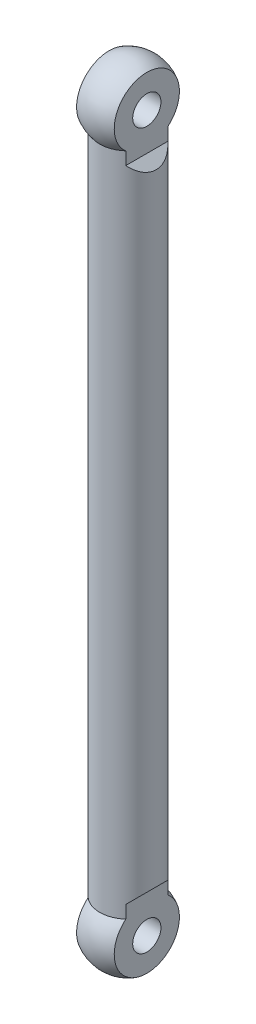
ISO-10303-21;
HEADER;
FILE_DESCRIPTION(('STEP AP214'),'2;1');
FILE_NAME('part.step','',(''),(''),'','','');
FILE_SCHEMA(('AUTOMOTIVE_DESIGN { 1 0 10303 214 1 1 1 1 }'));
ENDSEC;
DATA;
#1=APPLICATION_CONTEXT('core data for automotive mechanical design processes');
#2=APPLICATION_PROTOCOL_DEFINITION('international standard','automotive_design',2000,#1);
#3=PRODUCT_CONTEXT('',#1,'mechanical');
#4=PRODUCT('Part','Part','',(#3));
#5=PRODUCT_RELATED_PRODUCT_CATEGORY('part','',(#4));
#6=PRODUCT_DEFINITION_FORMATION('','',#4);
#7=PRODUCT_DEFINITION_CONTEXT('part definition',#1,'design');
#8=PRODUCT_DEFINITION('design','',#6,#7);
#9=PRODUCT_DEFINITION_SHAPE('','',#8);
#10=(LENGTH_UNIT() NAMED_UNIT(*) SI_UNIT(.MILLI.,.METRE.));
#11=(NAMED_UNIT(*) PLANE_ANGLE_UNIT() SI_UNIT($,.RADIAN.));
#12=(NAMED_UNIT(*) SI_UNIT($,.STERADIAN.) SOLID_ANGLE_UNIT());
#13=UNCERTAINTY_MEASURE_WITH_UNIT(LENGTH_MEASURE(1.E-05),#10,'distance_accuracy_value','');
#14=(GEOMETRIC_REPRESENTATION_CONTEXT(3) GLOBAL_UNCERTAINTY_ASSIGNED_CONTEXT((#13)) GLOBAL_UNIT_ASSIGNED_CONTEXT((#10,
#11,#12)) REPRESENTATION_CONTEXT('',''));
#15=CARTESIAN_POINT('',(0.,0.,0.));
#16=DIRECTION('',(0.,0.,1.));
#17=DIRECTION('',(1.,0.,0.));
#18=AXIS2_PLACEMENT_3D('',#15,#16,#17);
#19=CARTESIAN_POINT('',(0.,0.,0.));
#20=DIRECTION('',(0.,-1.,0.));
#21=DIRECTION('',(0.,0.,1.));
#22=AXIS2_PLACEMENT_3D('',#19,#20,#21);
#23=SPHERICAL_SURFACE('',#22,4.);
#24=CARTESIAN_POINT('',(0.,2.64575131106459,0.));
#25=DIRECTION('',(0.,-1.,0.));
#26=DIRECTION('',(0.,0.,-1.));
#27=AXIS2_PLACEMENT_3D('',#24,#25,#26);
#28=CIRCLE('',#27,3.);
#29=CARTESIAN_POINT('',(2.,2.64575131106459,2.23606797749979));
#30=VERTEX_POINT('',#29);
#31=CARTESIAN_POINT('',(-2.,2.64575131106459,2.23606797749979));
#32=VERTEX_POINT('',#31);
#33=EDGE_CURVE('E148',#30,#32,#28,.T.);
#34=ORIENTED_EDGE('',*,*,#33,.T.);
#35=CARTESIAN_POINT('',(-2.,0.,0.));
#36=DIRECTION('',(-1.,0.,0.));
#37=DIRECTION('',(0.,-1.,0.));
#38=AXIS2_PLACEMENT_3D('',#35,#36,#37);
#39=CIRCLE('',#38,3.46410161513776);
#40=CARTESIAN_POINT('',(-2.,2.64575131106459,-2.23606797749979));
#41=VERTEX_POINT('',#40);
#42=EDGE_CURVE('E60',#32,#41,#39,.F.);
#43=ORIENTED_EDGE('',*,*,#42,.T.);
#44=CARTESIAN_POINT('',(2.,2.64575131106459,-2.23606797749979));
#45=VERTEX_POINT('',#44);
#46=EDGE_CURVE('E144',#41,#45,#28,.T.);
#47=ORIENTED_EDGE('',*,*,#46,.T.);
#48=CARTESIAN_POINT('',(2.,0.,0.));
#49=DIRECTION('',(-1.,0.,0.));
#50=DIRECTION('',(0.,-1.,0.));
#51=AXIS2_PLACEMENT_3D('',#48,#49,#50);
#52=CIRCLE('',#51,3.46410161513776);
#53=EDGE_CURVE('E136',#30,#45,#52,.F.);
#54=ORIENTED_EDGE('',*,*,#53,.F.);
#55=EDGE_LOOP('',(#34,#43,#47,#54));
#56=FACE_BOUND('',#55,.T.);
#57=ADVANCED_FACE('F41',(#56),#23,.T.);
#58=CARTESIAN_POINT('',(0.,-4.,0.));
#59=DIRECTION('',(0.,-1.,0.));
#60=DIRECTION('',(0.,0.,-1.));
#61=AXIS2_PLACEMENT_3D('',#58,#59,#60);
#62=CYLINDRICAL_SURFACE('',#61,3.);
#63=ORIENTED_EDGE('',*,*,#46,.F.);
#64=DIRECTION('',(0.,-1.,0.));
#65=VECTOR('',#64,1.);
#66=CARTESIAN_POINT('',(-2.,-4.,-2.23606797749979));
#67=LINE('',#66,#65);
#68=CARTESIAN_POINT('',(-2.,3.99999999999999,-2.23606797749979));
#69=VERTEX_POINT('',#68);
#70=EDGE_CURVE('E47',#41,#69,#67,.F.);
#71=ORIENTED_EDGE('',*,*,#70,.T.);
#72=CARTESIAN_POINT('',(0.,1.99999999999999,0.));
#73=DIRECTION('',(-0.707106781186548,-0.707106781186547,0.));
#74=DIRECTION('',(0.707106781186547,-0.707106781186548,0.));
#75=AXIS2_PLACEMENT_3D('',#72,#73,#74);
#76=ELLIPSE('',#75,4.24264068711929,3.);
#77=CARTESIAN_POINT('',(-2.,3.99999999999999,2.23606797749979));
#78=VERTEX_POINT('',#77);
#79=EDGE_CURVE('E162',#69,#78,#76,.F.);
#80=ORIENTED_EDGE('',*,*,#79,.T.);
#81=DIRECTION('',(0.,-1.,0.));
#82=VECTOR('',#81,1.);
#83=CARTESIAN_POINT('',(-2.,-4.,2.23606797749979));
#84=LINE('',#83,#82);
#85=EDGE_CURVE('E161',#78,#32,#84,.T.);
#86=ORIENTED_EDGE('',*,*,#85,.T.);
#87=ORIENTED_EDGE('',*,*,#33,.F.);
#88=DIRECTION('',(0.,-1.,0.));
#89=VECTOR('',#88,1.);
#90=CARTESIAN_POINT('',(2.,-4.,2.23606797749979));
#91=LINE('',#90,#89);
#92=CARTESIAN_POINT('',(2.,3.99999999999999,2.23606797749979));
#93=VERTEX_POINT('',#92);
#94=EDGE_CURVE('E153',#93,#30,#91,.T.);
#95=ORIENTED_EDGE('',*,*,#94,.F.);
#96=CARTESIAN_POINT('',(0.,1.99999999999999,0.));
#97=DIRECTION('',(-0.707106781186548,0.707106781186547,0.));
#98=DIRECTION('',(-0.707106781186547,-0.707106781186548,0.));
#99=AXIS2_PLACEMENT_3D('',#96,#97,#98);
#100=ELLIPSE('',#99,4.24264068711929,3.);
#101=CARTESIAN_POINT('',(2.,3.99999999999999,-2.23606797749979));
#102=VERTEX_POINT('',#101);
#103=EDGE_CURVE('E151',#102,#93,#100,.F.);
#104=ORIENTED_EDGE('',*,*,#103,.F.);
#105=DIRECTION('',(0.,-1.,0.));
#106=VECTOR('',#105,1.);
#107=CARTESIAN_POINT('',(2.,-4.,-2.23606797749979));
#108=LINE('',#107,#106);
#109=EDGE_CURVE('E154',#45,#102,#108,.F.);
#110=ORIENTED_EDGE('',*,*,#109,.F.);
#111=EDGE_LOOP('',(#63,#71,#80,#86,#87,#95,#104,#110));
#112=FACE_BOUND('',#111,.T.);
#113=CARTESIAN_POINT('',(0.,74.,0.));
#114=DIRECTION('',(-0.707106781186548,0.707106781186547,0.));
#115=DIRECTION('',(-0.707106781186547,-0.707106781186548,0.));
#116=AXIS2_PLACEMENT_3D('',#113,#114,#115);
#117=ELLIPSE('',#116,4.24264068711929,3.);
#118=CARTESIAN_POINT('',(-2.,72.,2.23606797749979));
#119=VERTEX_POINT('',#118);
#120=CARTESIAN_POINT('',(-2.,72.,-2.23606797749979));
#121=VERTEX_POINT('',#120);
#122=EDGE_CURVE('E11',#119,#121,#117,.F.);
#123=ORIENTED_EDGE('',*,*,#122,.T.);
#124=DIRECTION('',(0.,-1.,0.));
#125=VECTOR('',#124,1.);
#126=CARTESIAN_POINT('',(-2.00000000000001,-4.,-2.23606797749978));
#127=LINE('',#126,#125);
#128=CARTESIAN_POINT('',(-2.,73.3542486889354,-2.23606797749979));
#129=VERTEX_POINT('',#128);
#130=EDGE_CURVE('E107',#121,#129,#127,.F.);
#131=ORIENTED_EDGE('',*,*,#130,.T.);
#132=CARTESIAN_POINT('',(0.,73.3542486889354,0.));
#133=DIRECTION('',(0.,-1.,0.));
#134=DIRECTION('',(0.,0.,-1.));
#135=AXIS2_PLACEMENT_3D('',#132,#133,#134);
#136=CIRCLE('',#135,3.);
#137=CARTESIAN_POINT('',(2.,73.3542486889354,-2.23606797749979));
#138=VERTEX_POINT('',#137);
#139=EDGE_CURVE('E142',#129,#138,#136,.T.);
#140=ORIENTED_EDGE('',*,*,#139,.T.);
#141=DIRECTION('',(0.,-1.,0.));
#142=VECTOR('',#141,1.);
#143=CARTESIAN_POINT('',(2.00000000000001,-4.,-2.23606797749978));
#144=LINE('',#143,#142);
#145=CARTESIAN_POINT('',(2.,72.,-2.23606797749978));
#146=VERTEX_POINT('',#145);
#147=EDGE_CURVE('E137',#146,#138,#144,.F.);
#148=ORIENTED_EDGE('',*,*,#147,.F.);
#149=CARTESIAN_POINT('',(0.,74.,0.));
#150=DIRECTION('',(-0.707106781186548,-0.707106781186547,0.));
#151=DIRECTION('',(0.707106781186547,-0.707106781186548,0.));
#152=AXIS2_PLACEMENT_3D('',#149,#150,#151);
#153=ELLIPSE('',#152,4.24264068711929,3.);
#154=CARTESIAN_POINT('',(2.,72.,2.23606797749978));
#155=VERTEX_POINT('',#154);
#156=EDGE_CURVE('E158',#155,#146,#153,.F.);
#157=ORIENTED_EDGE('',*,*,#156,.F.);
#158=DIRECTION('',(0.,-1.,0.));
#159=VECTOR('',#158,1.);
#160=CARTESIAN_POINT('',(2.00000000000001,-4.,2.23606797749978));
#161=LINE('',#160,#159);
#162=CARTESIAN_POINT('',(2.,73.3542486889354,2.23606797749979));
#163=VERTEX_POINT('',#162);
#164=EDGE_CURVE('E132',#163,#155,#161,.T.);
#165=ORIENTED_EDGE('',*,*,#164,.F.);
#166=CARTESIAN_POINT('',(-2.,73.3542486889354,2.23606797749979));
#167=VERTEX_POINT('',#166);
#168=EDGE_CURVE('E141',#163,#167,#136,.T.);
#169=ORIENTED_EDGE('',*,*,#168,.T.);
#170=DIRECTION('',(0.,-1.,0.));
#171=VECTOR('',#170,1.);
#172=CARTESIAN_POINT('',(-2.00000000000001,-4.,2.23606797749978));
#173=LINE('',#172,#171);
#174=EDGE_CURVE('E65',#167,#119,#173,.T.);
#175=ORIENTED_EDGE('',*,*,#174,.T.);
#176=EDGE_LOOP('',(#123,#131,#140,#148,#157,#165,#169,#175));
#177=FACE_BOUND('',#176,.T.);
#178=ADVANCED_FACE('F110',(#112,#177),#62,.T.);
#179=CARTESIAN_POINT('',(0.,76.,0.));
#180=DIRECTION('',(0.,-1.,0.));
#181=DIRECTION('',(0.,0.,-1.));
#182=AXIS2_PLACEMENT_3D('',#179,#180,#181);
#183=SPHERICAL_SURFACE('',#182,4.);
#184=ORIENTED_EDGE('',*,*,#139,.F.);
#185=CARTESIAN_POINT('',(-2.,76.,0.));
#186=DIRECTION('',(-1.,0.,0.));
#187=DIRECTION('',(0.,-1.,0.));
#188=AXIS2_PLACEMENT_3D('',#185,#186,#187);
#189=CIRCLE('',#188,3.46410161513776);
#190=EDGE_CURVE('E113',#129,#167,#189,.F.);
#191=ORIENTED_EDGE('',*,*,#190,.T.);
#192=ORIENTED_EDGE('',*,*,#168,.F.);
#193=CARTESIAN_POINT('',(2.,76.,0.));
#194=DIRECTION('',(-1.,0.,0.));
#195=DIRECTION('',(0.,-1.,0.));
#196=AXIS2_PLACEMENT_3D('',#193,#194,#195);
#197=CIRCLE('',#196,3.46410161513776);
#198=EDGE_CURVE('E149',#138,#163,#197,.F.);
#199=ORIENTED_EDGE('',*,*,#198,.F.);
#200=EDGE_LOOP('',(#184,#191,#192,#199));
#201=FACE_BOUND('',#200,.T.);
#202=ADVANCED_FACE('F214',(#201),#183,.T.);
#203=CARTESIAN_POINT('',(2.,72.,-4.));
#204=DIRECTION('',(-0.707106781186548,-0.707106781186547,0.));
#205=DIRECTION('',(0.707106781186547,-0.707106781186548,0.));
#206=AXIS2_PLACEMENT_3D('',#203,#204,#205);
#207=PLANE('',#206);
#208=ORIENTED_EDGE('',*,*,#156,.T.);
#209=DIRECTION('',(0.,0.,1.));
#210=VECTOR('',#209,1.);
#211=CARTESIAN_POINT('',(2.,72.,-4.));
#212=LINE('',#211,#210);
#213=EDGE_CURVE('E129',#146,#155,#212,.T.);
#214=ORIENTED_EDGE('',*,*,#213,.T.);
#215=EDGE_LOOP('',(#208,#214));
#216=FACE_BOUND('',#215,.T.);
#217=ADVANCED_FACE('F218',(#216),#207,.F.);
#218=CARTESIAN_POINT('',(2.,81.,-4.));
#219=DIRECTION('',(-1.,0.,0.));
#220=DIRECTION('',(0.,-1.,0.));
#221=AXIS2_PLACEMENT_3D('',#218,#219,#220);
#222=PLANE('',#221);
#223=CARTESIAN_POINT('',(2.,76.,0.));
#224=DIRECTION('',(1.,0.,0.));
#225=DIRECTION('',(0.,1.,0.));
#226=AXIS2_PLACEMENT_3D('',#223,#224,#225);
#227=CIRCLE('',#226,1.5);
#228=CARTESIAN_POINT('',(2.,77.5,0.));
#229=VERTEX_POINT('',#228);
#230=EDGE_CURVE('E166',#229,#229,#227,.T.);
#231=ORIENTED_EDGE('',*,*,#230,.F.);
#232=EDGE_LOOP('',(#231));
#233=FACE_BOUND('',#232,.T.);
#234=ORIENTED_EDGE('',*,*,#147,.T.);
#235=ORIENTED_EDGE('',*,*,#198,.T.);
#236=ORIENTED_EDGE('',*,*,#164,.T.);
#237=ORIENTED_EDGE('',*,*,#213,.F.);
#238=EDGE_LOOP('',(#234,#235,#236,#237));
#239=FACE_BOUND('',#238,.T.);
#240=ADVANCED_FACE('F183',(#233,#239),#222,.F.);
#241=CARTESIAN_POINT('',(2.,-5.00000000000002,-4.));
#242=DIRECTION('',(-1.,0.,0.));
#243=DIRECTION('',(0.,-1.,0.));
#244=AXIS2_PLACEMENT_3D('',#241,#242,#243);
#245=PLANE('',#244);
#246=CARTESIAN_POINT('',(2.00000000000001,0.,0.));
#247=DIRECTION('',(1.,0.,0.));
#248=DIRECTION('',(0.,1.,0.));
#249=AXIS2_PLACEMENT_3D('',#246,#247,#248);
#250=CIRCLE('',#249,1.5);
#251=CARTESIAN_POINT('',(2.00000000000001,1.5,0.));
#252=VERTEX_POINT('',#251);
#253=EDGE_CURVE('E121',#252,#252,#250,.T.);
#254=ORIENTED_EDGE('',*,*,#253,.F.);
#255=EDGE_LOOP('',(#254));
#256=FACE_BOUND('',#255,.T.);
#257=ORIENTED_EDGE('',*,*,#109,.T.);
#258=DIRECTION('',(0.,0.,1.));
#259=VECTOR('',#258,1.);
#260=CARTESIAN_POINT('',(2.,3.99999999999999,-4.));
#261=LINE('',#260,#259);
#262=EDGE_CURVE('E126',#102,#93,#261,.T.);
#263=ORIENTED_EDGE('',*,*,#262,.T.);
#264=ORIENTED_EDGE('',*,*,#94,.T.);
#265=ORIENTED_EDGE('',*,*,#53,.T.);
#266=EDGE_LOOP('',(#257,#263,#264,#265));
#267=FACE_BOUND('',#266,.T.);
#268=ADVANCED_FACE('F182',(#256,#267),#245,.F.);
#269=CARTESIAN_POINT('',(2.,3.99999999999999,-4.));
#270=DIRECTION('',(-0.707106781186548,0.707106781186547,0.));
#271=DIRECTION('',(-0.707106781186547,-0.707106781186548,0.));
#272=AXIS2_PLACEMENT_3D('',#269,#270,#271);
#273=PLANE('',#272);
#274=ORIENTED_EDGE('',*,*,#262,.F.);
#275=ORIENTED_EDGE('',*,*,#103,.T.);
#276=EDGE_LOOP('',(#274,#275));
#277=FACE_BOUND('',#276,.T.);
#278=ADVANCED_FACE('F184',(#277),#273,.F.);
#279=CARTESIAN_POINT('',(-2.,81.,-4.));
#280=DIRECTION('',(-1.,0.,0.));
#281=DIRECTION('',(0.,-1.,0.));
#282=AXIS2_PLACEMENT_3D('',#279,#280,#281);
#283=PLANE('',#282);
#284=CARTESIAN_POINT('',(-2.,76.,0.));
#285=DIRECTION('',(-1.,0.,0.));
#286=DIRECTION('',(0.,-1.,0.));
#287=AXIS2_PLACEMENT_3D('',#284,#285,#286);
#288=CIRCLE('',#287,1.5);
#289=CARTESIAN_POINT('',(-2.,74.5,0.));
#290=VERTEX_POINT('',#289);
#291=EDGE_CURVE('E42',#290,#290,#288,.T.);
#292=ORIENTED_EDGE('',*,*,#291,.F.);
#293=EDGE_LOOP('',(#292));
#294=FACE_BOUND('',#293,.T.);
#295=DIRECTION('',(0.,0.,1.));
#296=VECTOR('',#295,1.);
#297=CARTESIAN_POINT('',(-2.,72.,-4.));
#298=LINE('',#297,#296);
#299=EDGE_CURVE('E111',#121,#119,#298,.T.);
#300=ORIENTED_EDGE('',*,*,#299,.T.);
#301=ORIENTED_EDGE('',*,*,#174,.F.);
#302=ORIENTED_EDGE('',*,*,#190,.F.);
#303=ORIENTED_EDGE('',*,*,#130,.F.);
#304=EDGE_LOOP('',(#300,#301,#302,#303));
#305=FACE_BOUND('',#304,.T.);
#306=ADVANCED_FACE('F114',(#294,#305),#283,.T.);
#307=CARTESIAN_POINT('',(-2.,72.,-4.));
#308=DIRECTION('',(-0.707106781186548,0.707106781186547,0.));
#309=DIRECTION('',(-0.707106781186547,-0.707106781186548,0.));
#310=AXIS2_PLACEMENT_3D('',#307,#308,#309);
#311=PLANE('',#310);
#312=ORIENTED_EDGE('',*,*,#122,.F.);
#313=ORIENTED_EDGE('',*,*,#299,.F.);
#314=EDGE_LOOP('',(#312,#313));
#315=FACE_BOUND('',#314,.T.);
#316=ADVANCED_FACE('F117',(#315),#311,.T.);
#317=CARTESIAN_POINT('',(-2.,3.99999999999999,-4.));
#318=DIRECTION('',(-0.707106781186548,-0.707106781186547,0.));
#319=DIRECTION('',(0.707106781186547,-0.707106781186548,0.));
#320=AXIS2_PLACEMENT_3D('',#317,#318,#319);
#321=PLANE('',#320);
#322=DIRECTION('',(0.,0.,1.));
#323=VECTOR('',#322,1.);
#324=CARTESIAN_POINT('',(-2.,3.99999999999999,-4.));
#325=LINE('',#324,#323);
#326=EDGE_CURVE('E119',#69,#78,#325,.T.);
#327=ORIENTED_EDGE('',*,*,#326,.T.);
#328=ORIENTED_EDGE('',*,*,#79,.F.);
#329=EDGE_LOOP('',(#327,#328));
#330=FACE_BOUND('',#329,.T.);
#331=ADVANCED_FACE('F200',(#330),#321,.T.);
#332=CARTESIAN_POINT('',(-2.,-5.00000000000002,-4.));
#333=DIRECTION('',(-1.,0.,0.));
#334=DIRECTION('',(0.,-1.,0.));
#335=AXIS2_PLACEMENT_3D('',#332,#333,#334);
#336=PLANE('',#335);
#337=CARTESIAN_POINT('',(-2.,0.,0.));
#338=DIRECTION('',(-1.,0.,0.));
#339=DIRECTION('',(0.,-1.,0.));
#340=AXIS2_PLACEMENT_3D('',#337,#338,#339);
#341=CIRCLE('',#340,1.5);
#342=CARTESIAN_POINT('',(-2.,-1.5,0.));
#343=VERTEX_POINT('',#342);
#344=EDGE_CURVE('E170',#343,#343,#341,.T.);
#345=ORIENTED_EDGE('',*,*,#344,.F.);
#346=EDGE_LOOP('',(#345));
#347=FACE_BOUND('',#346,.T.);
#348=ORIENTED_EDGE('',*,*,#42,.F.);
#349=ORIENTED_EDGE('',*,*,#85,.F.);
#350=ORIENTED_EDGE('',*,*,#326,.F.);
#351=ORIENTED_EDGE('',*,*,#70,.F.);
#352=EDGE_LOOP('',(#348,#349,#350,#351));
#353=FACE_BOUND('',#352,.T.);
#354=ADVANCED_FACE('F197',(#347,#353),#336,.T.);
#355=CARTESIAN_POINT('',(-3.,0.,0.));
#356=DIRECTION('',(1.,0.,0.));
#357=DIRECTION('',(0.,1.,0.));
#358=AXIS2_PLACEMENT_3D('',#355,#356,#357);
#359=CYLINDRICAL_SURFACE('',#358,1.5);
#360=ORIENTED_EDGE('',*,*,#344,.T.);
#361=EDGE_LOOP('',(#360));
#362=FACE_BOUND('',#361,.T.);
#363=ORIENTED_EDGE('',*,*,#253,.T.);
#364=EDGE_LOOP('',(#363));
#365=FACE_BOUND('',#364,.T.);
#366=ADVANCED_FACE('F176',(#362,#365),#359,.F.);
#367=CARTESIAN_POINT('',(-3.00000000000001,76.,0.));
#368=DIRECTION('',(1.,0.,0.));
#369=DIRECTION('',(0.,1.,0.));
#370=AXIS2_PLACEMENT_3D('',#367,#368,#369);
#371=CYLINDRICAL_SURFACE('',#370,1.5);
#372=ORIENTED_EDGE('',*,*,#291,.T.);
#373=EDGE_LOOP('',(#372));
#374=FACE_BOUND('',#373,.T.);
#375=ORIENTED_EDGE('',*,*,#230,.T.);
#376=EDGE_LOOP('',(#375));
#377=FACE_BOUND('',#376,.T.);
#378=ADVANCED_FACE('F293',(#374,#377),#371,.F.);
#379=CLOSED_SHELL('',(#57,#178,#202,#217,#240,#268,#278,#306,#316,#331,#354,#366,#378));
#380=MANIFOLD_SOLID_BREP('B2',#379);
#381=ADVANCED_BREP_SHAPE_REPRESENTATION('',(#18,#380),#14);
#382=SHAPE_DEFINITION_REPRESENTATION(#9,#381);
ENDSEC;
END-ISO-10303-21;
